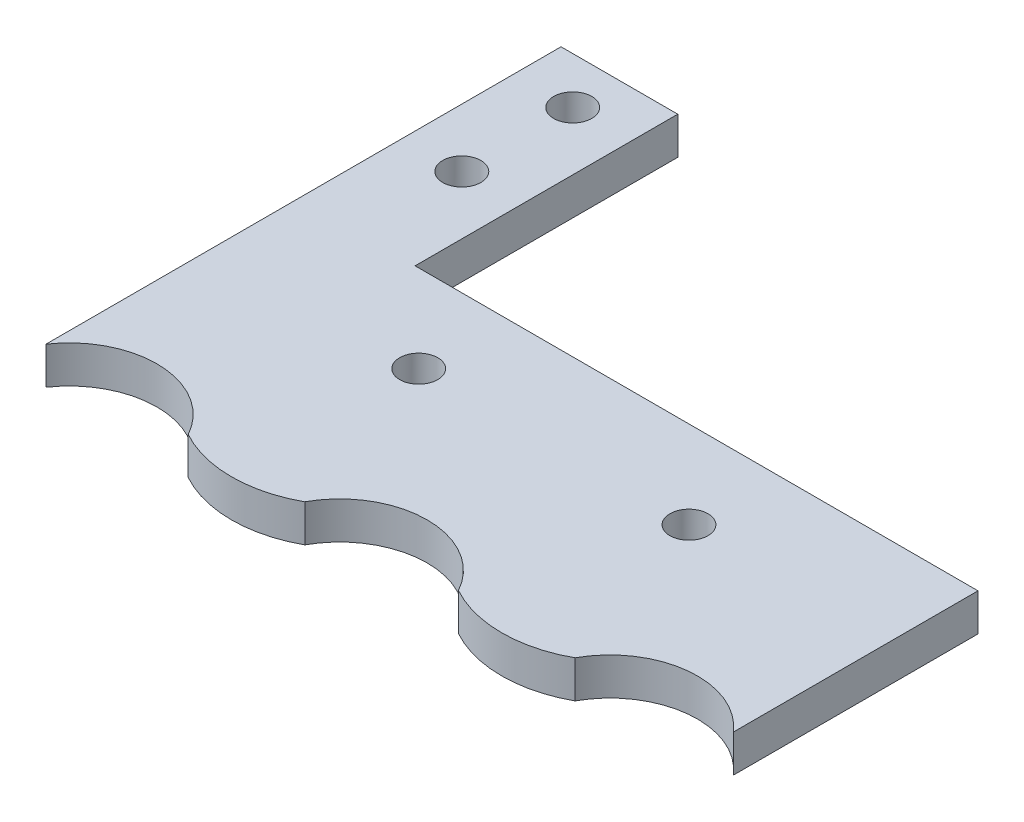
ISO-10303-21;
HEADER;
FILE_DESCRIPTION(('STEP AP214'),'2;1');
FILE_NAME('part.step','',(''),(''),'','','');
FILE_SCHEMA(('AUTOMOTIVE_DESIGN { 1 0 10303 214 1 1 1 1 }'));
ENDSEC;
DATA;
#1=APPLICATION_CONTEXT('core data for automotive mechanical design processes');
#2=APPLICATION_PROTOCOL_DEFINITION('international standard','automotive_design',2000,#1);
#3=PRODUCT_CONTEXT('',#1,'mechanical');
#4=PRODUCT('Part','Part','',(#3));
#5=PRODUCT_RELATED_PRODUCT_CATEGORY('part','',(#4));
#6=PRODUCT_DEFINITION_FORMATION('','',#4);
#7=PRODUCT_DEFINITION_CONTEXT('part definition',#1,'design');
#8=PRODUCT_DEFINITION('design','',#6,#7);
#9=PRODUCT_DEFINITION_SHAPE('','',#8);
#10=(LENGTH_UNIT() NAMED_UNIT(*) SI_UNIT(.MILLI.,.METRE.));
#11=(NAMED_UNIT(*) PLANE_ANGLE_UNIT() SI_UNIT($,.RADIAN.));
#12=(NAMED_UNIT(*) SI_UNIT($,.STERADIAN.) SOLID_ANGLE_UNIT());
#13=UNCERTAINTY_MEASURE_WITH_UNIT(LENGTH_MEASURE(1.E-05),#10,'distance_accuracy_value','');
#14=(GEOMETRIC_REPRESENTATION_CONTEXT(3) GLOBAL_UNCERTAINTY_ASSIGNED_CONTEXT((#13)) GLOBAL_UNIT_ASSIGNED_CONTEXT((#10,
#11,#12)) REPRESENTATION_CONTEXT('',''));
#15=CARTESIAN_POINT('',(0.,0.,0.));
#16=DIRECTION('',(0.,0.,1.));
#17=DIRECTION('',(1.,0.,0.));
#18=AXIS2_PLACEMENT_3D('',#15,#16,#17);
#19=CARTESIAN_POINT('',(-23.15,-3.2,0.));
#20=DIRECTION('',(0.,-1.,0.));
#21=DIRECTION('',(0.,0.,-1.));
#22=AXIS2_PLACEMENT_3D('',#19,#20,#21);
#23=PLANE('',#22);
#24=DIRECTION('',(0.,0.,1.));
#25=VECTOR('',#24,1.);
#26=CARTESIAN_POINT('',(28.8589649235001,-3.19999999999999,-25.825));
#27=LINE('',#26,#25);
#28=CARTESIAN_POINT('',(28.8589649235001,-3.20000000000002,-25.825));
#29=VERTEX_POINT('',#28);
#30=CARTESIAN_POINT('',(28.8589649235,-3.19999999999999,-4.86392017844105));
#31=VERTEX_POINT('',#30);
#32=EDGE_CURVE('E133',#29,#31,#27,.T.);
#33=ORIENTED_EDGE('',*,*,#32,.T.);
#34=CARTESIAN_POINT('',(23.15,-3.19999999999999,0.));
#35=DIRECTION('',(0.,-1.,0.));
#36=DIRECTION('',(0.,0.,-1.));
#37=AXIS2_PLACEMENT_3D('',#34,#35,#36);
#38=CIRCLE('',#37,7.5);
#39=CARTESIAN_POINT('',(16.5687400838012,-3.19999999999999,-3.59680662747318));
#40=VERTEX_POINT('',#39);
#41=EDGE_CURVE('E225',#31,#40,#38,.F.);
#42=ORIENTED_EDGE('',*,*,#41,.T.);
#43=CARTESIAN_POINT('',(11.575,-3.19999999999999,-12.6338517737274));
#44=DIRECTION('',(0.,-1.,0.));
#45=DIRECTION('',(0.,0.,-1.));
#46=AXIS2_PLACEMENT_3D('',#43,#44,#45);
#47=CIRCLE('',#46,10.325);
#48=CARTESIAN_POINT('',(6.58125991619879,-3.19999999999999,-3.59680662747319));
#49=VERTEX_POINT('',#48);
#50=EDGE_CURVE('E220',#40,#49,#47,.T.);
#51=ORIENTED_EDGE('',*,*,#50,.T.);
#52=CARTESIAN_POINT('',(0.,-3.19999999999999,0.));
#53=DIRECTION('',(0.,-1.,0.));
#54=DIRECTION('',(0.,0.,-1.));
#55=AXIS2_PLACEMENT_3D('',#52,#53,#54);
#56=CIRCLE('',#55,7.5);
#57=CARTESIAN_POINT('',(-6.58125991619879,-3.19999999999999,-3.59680662747318));
#58=VERTEX_POINT('',#57);
#59=EDGE_CURVE('E215',#49,#58,#56,.F.);
#60=ORIENTED_EDGE('',*,*,#59,.T.);
#61=CARTESIAN_POINT('',(-11.575,-3.19999999999999,-12.6338517737274));
#62=DIRECTION('',(0.,-1.,0.));
#63=DIRECTION('',(0.,0.,-1.));
#64=AXIS2_PLACEMENT_3D('',#61,#62,#63);
#65=CIRCLE('',#64,10.325);
#66=CARTESIAN_POINT('',(-16.5687400838012,-3.19999999999999,-3.59680662747318));
#67=VERTEX_POINT('',#66);
#68=EDGE_CURVE('E210',#58,#67,#65,.T.);
#69=ORIENTED_EDGE('',*,*,#68,.T.);
#70=CARTESIAN_POINT('',(-23.15,-3.19999999999999,0.));
#71=DIRECTION('',(0.,-1.,0.));
#72=DIRECTION('',(0.,0.,-1.));
#73=AXIS2_PLACEMENT_3D('',#70,#71,#72);
#74=CIRCLE('',#73,7.5);
#75=CARTESIAN_POINT('',(-29.3589649235001,-3.19999999999999,-4.20698877806276));
#76=VERTEX_POINT('',#75);
#77=EDGE_CURVE('E204',#67,#76,#74,.F.);
#78=ORIENTED_EDGE('',*,*,#77,.T.);
#79=DIRECTION('',(0.,0.,1.));
#80=VECTOR('',#79,1.);
#81=CARTESIAN_POINT('',(-29.3589649235001,-3.2,-25.825));
#82=LINE('',#81,#80);
#83=CARTESIAN_POINT('',(-29.3589649235001,-3.2,-48.325));
#84=VERTEX_POINT('',#83);
#85=EDGE_CURVE('E169',#84,#76,#82,.T.);
#86=ORIENTED_EDGE('',*,*,#85,.F.);
#87=DIRECTION('',(-1.,0.,0.));
#88=VECTOR('',#87,1.);
#89=CARTESIAN_POINT('',(-29.3589649235001,-3.2,-48.325));
#90=LINE('',#89,#88);
#91=CARTESIAN_POINT('',(-19.3589649235001,-3.2,-48.325));
#92=VERTEX_POINT('',#91);
#93=EDGE_CURVE('E158',#92,#84,#90,.T.);
#94=ORIENTED_EDGE('',*,*,#93,.F.);
#95=DIRECTION('',(0.,0.,-1.));
#96=VECTOR('',#95,1.);
#97=CARTESIAN_POINT('',(-19.3589649235001,-3.2,-48.325));
#98=LINE('',#97,#96);
#99=CARTESIAN_POINT('',(-19.3589649235001,-3.2,-25.825));
#100=VERTEX_POINT('',#99);
#101=EDGE_CURVE('E152',#100,#92,#98,.T.);
#102=ORIENTED_EDGE('',*,*,#101,.F.);
#103=DIRECTION('',(-1.,0.,0.));
#104=VECTOR('',#103,1.);
#105=CARTESIAN_POINT('',(-19.3589649235001,-3.2,-25.825));
#106=LINE('',#105,#104);
#107=EDGE_CURVE('E91',#29,#100,#106,.T.);
#108=ORIENTED_EDGE('',*,*,#107,.F.);
#109=EDGE_LOOP('',(#33,#42,#51,#60,#69,#78,#86,#94,#102,#108));
#110=FACE_BOUND('',#109,.T.);
#111=CARTESIAN_POINT('',(-11.575,-3.2,-18.35));
#112=DIRECTION('',(0.,-1.,0.));
#113=DIRECTION('',(0.,0.,-1.));
#114=AXIS2_PLACEMENT_3D('',#111,#112,#113);
#115=CIRCLE('',#114,1.63195);
#116=CARTESIAN_POINT('',(-11.575,-3.2,-19.98195));
#117=VERTEX_POINT('',#116);
#118=EDGE_CURVE('E244',#117,#117,#115,.F.);
#119=ORIENTED_EDGE('',*,*,#118,.T.);
#120=EDGE_LOOP('',(#119));
#121=FACE_BOUND('',#120,.T.);
#122=CARTESIAN_POINT('',(-24.3589649235001,-3.2,-34.825));
#123=DIRECTION('',(0.,-1.,0.));
#124=DIRECTION('',(0.,0.,-1.));
#125=AXIS2_PLACEMENT_3D('',#122,#123,#124);
#126=CIRCLE('',#125,1.635);
#127=CARTESIAN_POINT('',(-24.3589649235001,-3.2,-36.46));
#128=VERTEX_POINT('',#127);
#129=EDGE_CURVE('E256',#128,#128,#126,.F.);
#130=ORIENTED_EDGE('',*,*,#129,.T.);
#131=EDGE_LOOP('',(#130));
#132=FACE_BOUND('',#131,.T.);
#133=CARTESIAN_POINT('',(-24.3589649235001,-3.2,-44.325));
#134=DIRECTION('',(0.,-1.,0.));
#135=DIRECTION('',(0.,0.,-1.));
#136=AXIS2_PLACEMENT_3D('',#133,#134,#135);
#137=CIRCLE('',#136,1.635);
#138=CARTESIAN_POINT('',(-24.3589649235001,-3.2,-45.96));
#139=VERTEX_POINT('',#138);
#140=EDGE_CURVE('E175',#139,#139,#137,.F.);
#141=ORIENTED_EDGE('',*,*,#140,.T.);
#142=EDGE_LOOP('',(#141));
#143=FACE_BOUND('',#142,.T.);
#144=CARTESIAN_POINT('',(11.575,-3.2,-18.35));
#145=DIRECTION('',(0.,-1.,0.));
#146=DIRECTION('',(0.,0.,-1.));
#147=AXIS2_PLACEMENT_3D('',#144,#145,#146);
#148=CIRCLE('',#147,1.63195);
#149=CARTESIAN_POINT('',(11.575,-3.2,-19.98195));
#150=VERTEX_POINT('',#149);
#151=EDGE_CURVE('E252',#150,#150,#148,.F.);
#152=ORIENTED_EDGE('',*,*,#151,.T.);
#153=EDGE_LOOP('',(#152));
#154=FACE_BOUND('',#153,.T.);
#155=ADVANCED_FACE('F44',(#110,#121,#132,#143,#154),#23,.T.);
#156=CARTESIAN_POINT('',(-29.3589649235001,-3.2,-3.23245333744294));
#157=DIRECTION('',(-1.,0.,0.));
#158=DIRECTION('',(0.,0.,1.));
#159=AXIS2_PLACEMENT_3D('',#156,#157,#158);
#160=PLANE('',#159);
#161=DIRECTION('',(0.,1.,0.));
#162=VECTOR('',#161,1.);
#163=CARTESIAN_POINT('',(-29.3589649235,-73.6644188017118,-4.20698877806276));
#164=LINE('',#163,#162);
#165=CARTESIAN_POINT('',(-29.3589649235001,0.,-4.20698877806276));
#166=VERTEX_POINT('',#165);
#167=EDGE_CURVE('E208',#166,#76,#164,.F.);
#168=ORIENTED_EDGE('',*,*,#167,.F.);
#169=DIRECTION('',(0.,0.,1.));
#170=VECTOR('',#169,1.);
#171=CARTESIAN_POINT('',(-29.3589649235001,0.,-3.23245333744294));
#172=LINE('',#171,#170);
#173=CARTESIAN_POINT('',(-29.3589649235001,0.,-48.325));
#174=VERTEX_POINT('',#173);
#175=EDGE_CURVE('E85',#174,#166,#172,.T.);
#176=ORIENTED_EDGE('',*,*,#175,.F.);
#177=DIRECTION('',(0.,1.,0.));
#178=VECTOR('',#177,1.);
#179=CARTESIAN_POINT('',(-29.3589649235001,-3.2,-48.325));
#180=LINE('',#179,#178);
#181=EDGE_CURVE('E11',#84,#174,#180,.T.);
#182=ORIENTED_EDGE('',*,*,#181,.F.);
#183=ORIENTED_EDGE('',*,*,#85,.T.);
#184=EDGE_LOOP('',(#168,#176,#182,#183));
#185=FACE_BOUND('',#184,.T.);
#186=ADVANCED_FACE('F291',(#185),#160,.T.);
#187=CARTESIAN_POINT('',(-29.3589649235001,-3.2,-48.325));
#188=DIRECTION('',(0.,0.,-1.));
#189=DIRECTION('',(-1.,0.,0.));
#190=AXIS2_PLACEMENT_3D('',#187,#188,#189);
#191=PLANE('',#190);
#192=DIRECTION('',(-1.,0.,0.));
#193=VECTOR('',#192,1.);
#194=CARTESIAN_POINT('',(-29.3589649235001,0.,-48.325));
#195=LINE('',#194,#193);
#196=CARTESIAN_POINT('',(-19.3589649235001,0.,-48.325));
#197=VERTEX_POINT('',#196);
#198=EDGE_CURVE('E160',#197,#174,#195,.T.);
#199=ORIENTED_EDGE('',*,*,#198,.F.);
#200=DIRECTION('',(0.,1.,0.));
#201=VECTOR('',#200,1.);
#202=CARTESIAN_POINT('',(-19.3589649235001,-3.2,-48.325));
#203=LINE('',#202,#201);
#204=EDGE_CURVE('E54',#92,#197,#203,.T.);
#205=ORIENTED_EDGE('',*,*,#204,.F.);
#206=ORIENTED_EDGE('',*,*,#93,.T.);
#207=ORIENTED_EDGE('',*,*,#181,.T.);
#208=EDGE_LOOP('',(#199,#205,#206,#207));
#209=FACE_BOUND('',#208,.T.);
#210=ADVANCED_FACE('F296',(#209),#191,.T.);
#211=CARTESIAN_POINT('',(-19.3589649235001,-3.2,-48.325));
#212=DIRECTION('',(1.,0.,0.));
#213=DIRECTION('',(0.,0.,-1.));
#214=AXIS2_PLACEMENT_3D('',#211,#212,#213);
#215=PLANE('',#214);
#216=DIRECTION('',(0.,0.,-1.));
#217=VECTOR('',#216,1.);
#218=CARTESIAN_POINT('',(-19.3589649235001,0.,-48.325));
#219=LINE('',#218,#217);
#220=CARTESIAN_POINT('',(-19.3589649235001,0.,-25.825));
#221=VERTEX_POINT('',#220);
#222=EDGE_CURVE('E174',#221,#197,#219,.T.);
#223=ORIENTED_EDGE('',*,*,#222,.F.);
#224=DIRECTION('',(0.,1.,0.));
#225=VECTOR('',#224,1.);
#226=CARTESIAN_POINT('',(-19.3589649235001,-3.2,-25.825));
#227=LINE('',#226,#225);
#228=EDGE_CURVE('E48',#100,#221,#227,.T.);
#229=ORIENTED_EDGE('',*,*,#228,.F.);
#230=ORIENTED_EDGE('',*,*,#101,.T.);
#231=ORIENTED_EDGE('',*,*,#204,.T.);
#232=EDGE_LOOP('',(#223,#229,#230,#231));
#233=FACE_BOUND('',#232,.T.);
#234=ADVANCED_FACE('F188',(#233),#215,.T.);
#235=CARTESIAN_POINT('',(-19.3589649235001,-3.2,-25.825));
#236=DIRECTION('',(0.,0.,-1.));
#237=DIRECTION('',(-1.,0.,0.));
#238=AXIS2_PLACEMENT_3D('',#235,#236,#237);
#239=PLANE('',#238);
#240=DIRECTION('',(0.,1.,0.));
#241=VECTOR('',#240,1.);
#242=CARTESIAN_POINT('',(28.8589649235001,-73.6644188017118,-25.825));
#243=LINE('',#242,#241);
#244=CARTESIAN_POINT('',(28.8589649235001,0.,-25.825));
#245=VERTEX_POINT('',#244);
#246=EDGE_CURVE('E136',#29,#245,#243,.T.);
#247=ORIENTED_EDGE('',*,*,#246,.F.);
#248=ORIENTED_EDGE('',*,*,#107,.T.);
#249=ORIENTED_EDGE('',*,*,#228,.T.);
#250=DIRECTION('',(-1.,0.,0.));
#251=VECTOR('',#250,1.);
#252=CARTESIAN_POINT('',(-19.3589649235001,0.,-25.825));
#253=LINE('',#252,#251);
#254=EDGE_CURVE('E144',#245,#221,#253,.T.);
#255=ORIENTED_EDGE('',*,*,#254,.F.);
#256=EDGE_LOOP('',(#247,#248,#249,#255));
#257=FACE_BOUND('',#256,.T.);
#258=ADVANCED_FACE('F46',(#257),#239,.T.);
#259=CARTESIAN_POINT('',(-23.15,0.,0.));
#260=DIRECTION('',(0.,-1.,0.));
#261=DIRECTION('',(0.,0.,-1.));
#262=AXIS2_PLACEMENT_3D('',#259,#260,#261);
#263=PLANE('',#262);
#264=CARTESIAN_POINT('',(-11.575,0.,-18.35));
#265=DIRECTION('',(0.,1.,0.));
#266=DIRECTION('',(0.,0.,1.));
#267=AXIS2_PLACEMENT_3D('',#264,#265,#266);
#268=CIRCLE('',#267,1.63195);
#269=CARTESIAN_POINT('',(-11.575,0.,-16.71805));
#270=VERTEX_POINT('',#269);
#271=EDGE_CURVE('E240',#270,#270,#268,.T.);
#272=ORIENTED_EDGE('',*,*,#271,.F.);
#273=EDGE_LOOP('',(#272));
#274=FACE_BOUND('',#273,.T.);
#275=CARTESIAN_POINT('',(11.575,0.,-18.35));
#276=DIRECTION('',(0.,1.,0.));
#277=DIRECTION('',(0.,0.,1.));
#278=AXIS2_PLACEMENT_3D('',#275,#276,#277);
#279=CIRCLE('',#278,1.63195);
#280=CARTESIAN_POINT('',(11.575,0.,-16.71805));
#281=VERTEX_POINT('',#280);
#282=EDGE_CURVE('E248',#281,#281,#279,.T.);
#283=ORIENTED_EDGE('',*,*,#282,.F.);
#284=EDGE_LOOP('',(#283));
#285=FACE_BOUND('',#284,.T.);
#286=CARTESIAN_POINT('',(-24.3589649235001,0.,-44.325));
#287=DIRECTION('',(0.,1.,0.));
#288=DIRECTION('',(0.,0.,1.));
#289=AXIS2_PLACEMENT_3D('',#286,#287,#288);
#290=CIRCLE('',#289,1.635);
#291=CARTESIAN_POINT('',(-24.3589649235001,0.,-42.69));
#292=VERTEX_POINT('',#291);
#293=EDGE_CURVE('E257',#292,#292,#290,.T.);
#294=ORIENTED_EDGE('',*,*,#293,.F.);
#295=EDGE_LOOP('',(#294));
#296=FACE_BOUND('',#295,.T.);
#297=CARTESIAN_POINT('',(-24.3589649235001,0.,-34.825));
#298=DIRECTION('',(0.,1.,0.));
#299=DIRECTION('',(0.,0.,1.));
#300=AXIS2_PLACEMENT_3D('',#297,#298,#299);
#301=CIRCLE('',#300,1.635);
#302=CARTESIAN_POINT('',(-24.3589649235001,0.,-33.19));
#303=VERTEX_POINT('',#302);
#304=EDGE_CURVE('E163',#303,#303,#301,.T.);
#305=ORIENTED_EDGE('',*,*,#304,.F.);
#306=EDGE_LOOP('',(#305));
#307=FACE_BOUND('',#306,.T.);
#308=CARTESIAN_POINT('',(23.15,0.,0.));
#309=DIRECTION('',(0.,1.,0.));
#310=DIRECTION('',(0.,0.,1.));
#311=AXIS2_PLACEMENT_3D('',#308,#309,#310);
#312=CIRCLE('',#311,7.5);
#313=CARTESIAN_POINT('',(28.8589649235,0.,-4.86392017844105));
#314=VERTEX_POINT('',#313);
#315=CARTESIAN_POINT('',(16.5687400838012,0.,-3.59680662747319));
#316=VERTEX_POINT('',#315);
#317=EDGE_CURVE('E195',#314,#316,#312,.T.);
#318=ORIENTED_EDGE('',*,*,#317,.F.);
#319=DIRECTION('',(0.,0.,1.));
#320=VECTOR('',#319,1.);
#321=CARTESIAN_POINT('',(28.8589649235001,0.,-25.825));
#322=LINE('',#321,#320);
#323=EDGE_CURVE('E192',#245,#314,#322,.T.);
#324=ORIENTED_EDGE('',*,*,#323,.F.);
#325=ORIENTED_EDGE('',*,*,#254,.T.);
#326=ORIENTED_EDGE('',*,*,#222,.T.);
#327=ORIENTED_EDGE('',*,*,#198,.T.);
#328=ORIENTED_EDGE('',*,*,#175,.T.);
#329=CARTESIAN_POINT('',(-23.15,0.,0.));
#330=DIRECTION('',(0.,1.,0.));
#331=DIRECTION('',(0.,0.,1.));
#332=AXIS2_PLACEMENT_3D('',#329,#330,#331);
#333=CIRCLE('',#332,7.5);
#334=CARTESIAN_POINT('',(-16.5687400838012,0.,-3.59680662747318));
#335=VERTEX_POINT('',#334);
#336=EDGE_CURVE('E146',#335,#166,#333,.T.);
#337=ORIENTED_EDGE('',*,*,#336,.F.);
#338=CARTESIAN_POINT('',(-11.575,0.,-12.6338517737274));
#339=DIRECTION('',(0.,-1.,0.));
#340=DIRECTION('',(0.,0.,1.));
#341=AXIS2_PLACEMENT_3D('',#338,#339,#340);
#342=CIRCLE('',#341,10.325);
#343=CARTESIAN_POINT('',(-6.58125991619879,0.,-3.59680662747318));
#344=VERTEX_POINT('',#343);
#345=EDGE_CURVE('E62',#344,#335,#342,.T.);
#346=ORIENTED_EDGE('',*,*,#345,.F.);
#347=CARTESIAN_POINT('',(0.,0.,0.));
#348=DIRECTION('',(0.,1.,0.));
#349=DIRECTION('',(0.,0.,1.));
#350=AXIS2_PLACEMENT_3D('',#347,#348,#349);
#351=CIRCLE('',#350,7.5);
#352=CARTESIAN_POINT('',(6.58125991619879,0.,-3.59680662747319));
#353=VERTEX_POINT('',#352);
#354=EDGE_CURVE('E334',#353,#344,#351,.T.);
#355=ORIENTED_EDGE('',*,*,#354,.F.);
#356=CARTESIAN_POINT('',(11.575,0.,-12.6338517737274));
#357=DIRECTION('',(0.,-1.,0.));
#358=DIRECTION('',(0.,0.,1.));
#359=AXIS2_PLACEMENT_3D('',#356,#357,#358);
#360=CIRCLE('',#359,10.325);
#361=EDGE_CURVE('E200',#316,#353,#360,.T.);
#362=ORIENTED_EDGE('',*,*,#361,.F.);
#363=EDGE_LOOP('',(#318,#324,#325,#326,#327,#328,#337,#346,#355,#362));
#364=FACE_BOUND('',#363,.T.);
#365=ADVANCED_FACE('F191',(#274,#285,#296,#307,#364),#263,.F.);
#366=CARTESIAN_POINT('',(-24.3589649235001,-7.82447834896003,-34.825));
#367=DIRECTION('',(0.,1.,0.));
#368=DIRECTION('',(0.,0.,1.));
#369=AXIS2_PLACEMENT_3D('',#366,#367,#368);
#370=CYLINDRICAL_SURFACE('',#369,1.635);
#371=ORIENTED_EDGE('',*,*,#304,.T.);
#372=EDGE_LOOP('',(#371));
#373=FACE_BOUND('',#372,.T.);
#374=ORIENTED_EDGE('',*,*,#129,.F.);
#375=EDGE_LOOP('',(#374));
#376=FACE_BOUND('',#375,.T.);
#377=ADVANCED_FACE('F273',(#373,#376),#370,.F.);
#378=CARTESIAN_POINT('',(-24.3589649235001,-7.82447834896003,-44.325));
#379=DIRECTION('',(0.,1.,0.));
#380=DIRECTION('',(0.,0.,1.));
#381=AXIS2_PLACEMENT_3D('',#378,#379,#380);
#382=CYLINDRICAL_SURFACE('',#381,1.635);
#383=ORIENTED_EDGE('',*,*,#293,.T.);
#384=EDGE_LOOP('',(#383));
#385=FACE_BOUND('',#384,.T.);
#386=ORIENTED_EDGE('',*,*,#140,.F.);
#387=EDGE_LOOP('',(#386));
#388=FACE_BOUND('',#387,.T.);
#389=ADVANCED_FACE('F284',(#385,#388),#382,.F.);
#390=CARTESIAN_POINT('',(11.575,0.,-18.35));
#391=DIRECTION('',(0.,1.,0.));
#392=DIRECTION('',(0.,0.,1.));
#393=AXIS2_PLACEMENT_3D('',#390,#391,#392);
#394=CYLINDRICAL_SURFACE('',#393,1.63195);
#395=ORIENTED_EDGE('',*,*,#151,.F.);
#396=EDGE_LOOP('',(#395));
#397=FACE_BOUND('',#396,.T.);
#398=ORIENTED_EDGE('',*,*,#282,.T.);
#399=EDGE_LOOP('',(#398));
#400=FACE_BOUND('',#399,.T.);
#401=ADVANCED_FACE('F300',(#397,#400),#394,.F.);
#402=CARTESIAN_POINT('',(-11.575,0.,-18.35));
#403=DIRECTION('',(0.,1.,0.));
#404=DIRECTION('',(0.,0.,1.));
#405=AXIS2_PLACEMENT_3D('',#402,#403,#404);
#406=CYLINDRICAL_SURFACE('',#405,1.63195);
#407=ORIENTED_EDGE('',*,*,#118,.F.);
#408=EDGE_LOOP('',(#407));
#409=FACE_BOUND('',#408,.T.);
#410=ORIENTED_EDGE('',*,*,#271,.T.);
#411=EDGE_LOOP('',(#410));
#412=FACE_BOUND('',#411,.T.);
#413=ADVANCED_FACE('F304',(#409,#412),#406,.F.);
#414=CARTESIAN_POINT('',(28.8589649235001,-73.6644188017118,-25.825));
#415=DIRECTION('',(-1.,0.,0.));
#416=DIRECTION('',(0.,0.,1.));
#417=AXIS2_PLACEMENT_3D('',#414,#415,#416);
#418=PLANE('',#417);
#419=ORIENTED_EDGE('',*,*,#246,.T.);
#420=ORIENTED_EDGE('',*,*,#323,.T.);
#421=DIRECTION('',(0.,1.,0.));
#422=VECTOR('',#421,1.);
#423=CARTESIAN_POINT('',(28.8589649235,-73.6644188017118,-4.86392017844105));
#424=LINE('',#423,#422);
#425=EDGE_CURVE('E138',#31,#314,#424,.T.);
#426=ORIENTED_EDGE('',*,*,#425,.F.);
#427=ORIENTED_EDGE('',*,*,#32,.F.);
#428=EDGE_LOOP('',(#419,#420,#426,#427));
#429=FACE_BOUND('',#428,.T.);
#430=ADVANCED_FACE('F134',(#429),#418,.F.);
#431=CARTESIAN_POINT('',(23.15,-73.6644188017118,0.));
#432=DIRECTION('',(0.,1.,0.));
#433=DIRECTION('',(0.,0.,1.));
#434=AXIS2_PLACEMENT_3D('',#431,#432,#433);
#435=CYLINDRICAL_SURFACE('',#434,7.5);
#436=ORIENTED_EDGE('',*,*,#425,.T.);
#437=ORIENTED_EDGE('',*,*,#317,.T.);
#438=DIRECTION('',(0.,1.,0.));
#439=VECTOR('',#438,1.);
#440=CARTESIAN_POINT('',(16.5687400838012,-73.6644188017118,-3.59680662747319));
#441=LINE('',#440,#439);
#442=EDGE_CURVE('E224',#40,#316,#441,.T.);
#443=ORIENTED_EDGE('',*,*,#442,.F.);
#444=ORIENTED_EDGE('',*,*,#41,.F.);
#445=EDGE_LOOP('',(#436,#437,#443,#444));
#446=FACE_BOUND('',#445,.T.);
#447=ADVANCED_FACE('F309',(#446),#435,.F.);
#448=CARTESIAN_POINT('',(11.575,-73.6644188017118,-12.6338517737274));
#449=DIRECTION('',(0.,1.,0.));
#450=DIRECTION('',(0.,0.,1.));
#451=AXIS2_PLACEMENT_3D('',#448,#449,#450);
#452=CYLINDRICAL_SURFACE('',#451,10.325);
#453=ORIENTED_EDGE('',*,*,#442,.T.);
#454=ORIENTED_EDGE('',*,*,#361,.T.);
#455=DIRECTION('',(0.,1.,0.));
#456=VECTOR('',#455,1.);
#457=CARTESIAN_POINT('',(6.58125991619879,-73.6644188017118,-3.59680662747319));
#458=LINE('',#457,#456);
#459=EDGE_CURVE('E219',#49,#353,#458,.T.);
#460=ORIENTED_EDGE('',*,*,#459,.F.);
#461=ORIENTED_EDGE('',*,*,#50,.F.);
#462=EDGE_LOOP('',(#453,#454,#460,#461));
#463=FACE_BOUND('',#462,.T.);
#464=ADVANCED_FACE('F312',(#463),#452,.T.);
#465=CARTESIAN_POINT('',(0.,-73.6644188017118,0.));
#466=DIRECTION('',(0.,1.,0.));
#467=DIRECTION('',(0.,0.,1.));
#468=AXIS2_PLACEMENT_3D('',#465,#466,#467);
#469=CYLINDRICAL_SURFACE('',#468,7.5);
#470=ORIENTED_EDGE('',*,*,#459,.T.);
#471=ORIENTED_EDGE('',*,*,#354,.T.);
#472=DIRECTION('',(0.,1.,0.));
#473=VECTOR('',#472,1.);
#474=CARTESIAN_POINT('',(-6.58125991619879,-73.6644188017118,-3.59680662747318));
#475=LINE('',#474,#473);
#476=EDGE_CURVE('E214',#58,#344,#475,.T.);
#477=ORIENTED_EDGE('',*,*,#476,.F.);
#478=ORIENTED_EDGE('',*,*,#59,.F.);
#479=EDGE_LOOP('',(#470,#471,#477,#478));
#480=FACE_BOUND('',#479,.T.);
#481=ADVANCED_FACE('F316',(#480),#469,.F.);
#482=CARTESIAN_POINT('',(-11.575,-73.6644188017118,-12.6338517737274));
#483=DIRECTION('',(0.,1.,0.));
#484=DIRECTION('',(0.,0.,1.));
#485=AXIS2_PLACEMENT_3D('',#482,#483,#484);
#486=CYLINDRICAL_SURFACE('',#485,10.325);
#487=ORIENTED_EDGE('',*,*,#476,.T.);
#488=ORIENTED_EDGE('',*,*,#345,.T.);
#489=DIRECTION('',(0.,1.,0.));
#490=VECTOR('',#489,1.);
#491=CARTESIAN_POINT('',(-16.5687400838012,-73.6644188017118,-3.59680662747318));
#492=LINE('',#491,#490);
#493=EDGE_CURVE('E209',#67,#335,#492,.T.);
#494=ORIENTED_EDGE('',*,*,#493,.F.);
#495=ORIENTED_EDGE('',*,*,#68,.F.);
#496=EDGE_LOOP('',(#487,#488,#494,#495));
#497=FACE_BOUND('',#496,.T.);
#498=ADVANCED_FACE('F320',(#497),#486,.T.);
#499=CARTESIAN_POINT('',(-23.15,-73.6644188017118,0.));
#500=DIRECTION('',(0.,1.,0.));
#501=DIRECTION('',(0.,0.,1.));
#502=AXIS2_PLACEMENT_3D('',#499,#500,#501);
#503=CYLINDRICAL_SURFACE('',#502,7.5);
#504=ORIENTED_EDGE('',*,*,#167,.T.);
#505=ORIENTED_EDGE('',*,*,#77,.F.);
#506=ORIENTED_EDGE('',*,*,#493,.T.);
#507=ORIENTED_EDGE('',*,*,#336,.T.);
#508=EDGE_LOOP('',(#504,#505,#506,#507));
#509=FACE_BOUND('',#508,.T.);
#510=ADVANCED_FACE('F324',(#509),#503,.F.);
#511=CLOSED_SHELL('',(#155,#186,#210,#234,#258,#365,#377,#389,#401,#413,#430,#447,#464,#481,
#498,#510));
#512=MANIFOLD_SOLID_BREP('B2',#511);
#513=ADVANCED_BREP_SHAPE_REPRESENTATION('',(#18,#512),#14);
#514=SHAPE_DEFINITION_REPRESENTATION(#9,#513);
ENDSEC;
END-ISO-10303-21;
